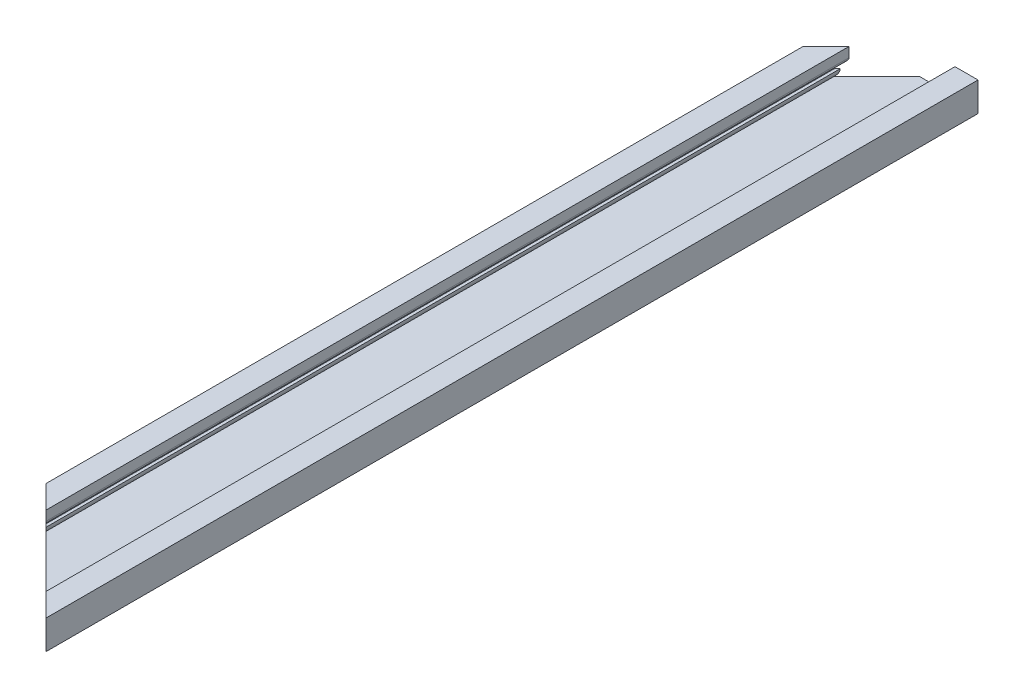
ISO-10303-21;
HEADER;
FILE_DESCRIPTION(('STEP AP214'),'2;1');
FILE_NAME('part.step','',(''),(''),'','','');
FILE_SCHEMA(('AUTOMOTIVE_DESIGN { 1 0 10303 214 1 1 1 1 }'));
ENDSEC;
DATA;
#1=APPLICATION_CONTEXT('core data for automotive mechanical design processes');
#2=APPLICATION_PROTOCOL_DEFINITION('international standard','automotive_design',2000,#1);
#3=PRODUCT_CONTEXT('',#1,'mechanical');
#4=PRODUCT('Part','Part','',(#3));
#5=PRODUCT_RELATED_PRODUCT_CATEGORY('part','',(#4));
#6=PRODUCT_DEFINITION_FORMATION('','',#4);
#7=PRODUCT_DEFINITION_CONTEXT('part definition',#1,'design');
#8=PRODUCT_DEFINITION('design','',#6,#7);
#9=PRODUCT_DEFINITION_SHAPE('','',#8);
#10=(LENGTH_UNIT() NAMED_UNIT(*) SI_UNIT(.MILLI.,.METRE.));
#11=(NAMED_UNIT(*) PLANE_ANGLE_UNIT() SI_UNIT($,.RADIAN.));
#12=(NAMED_UNIT(*) SI_UNIT($,.STERADIAN.) SOLID_ANGLE_UNIT());
#13=UNCERTAINTY_MEASURE_WITH_UNIT(LENGTH_MEASURE(1.E-05),#10,'distance_accuracy_value','');
#14=(GEOMETRIC_REPRESENTATION_CONTEXT(3) GLOBAL_UNCERTAINTY_ASSIGNED_CONTEXT((#13)) GLOBAL_UNIT_ASSIGNED_CONTEXT((#10,
#11,#12)) REPRESENTATION_CONTEXT('',''));
#15=CARTESIAN_POINT('',(0.,0.,0.));
#16=DIRECTION('',(0.,0.,1.));
#17=DIRECTION('',(1.,0.,0.));
#18=AXIS2_PLACEMENT_3D('',#15,#16,#17);
#19=CARTESIAN_POINT('',(-30.,7.5,510.));
#20=DIRECTION('',(0.,-1.,0.));
#21=DIRECTION('',(0.,0.,-1.));
#22=AXIS2_PLACEMENT_3D('',#19,#20,#21);
#23=PLANE('',#22);
#24=DIRECTION('',(0.707106781186546,0.,-0.707106781186549));
#25=VECTOR('',#24,1.);
#26=CARTESIAN_POINT('',(15.0000000000001,7.5,15.));
#27=LINE('',#26,#25);
#28=CARTESIAN_POINT('',(-30.,7.5,60.0000000000002));
#29=VERTEX_POINT('',#28);
#30=CARTESIAN_POINT('',(-18.1568883594902,7.5,48.1568883594904));
#31=VERTEX_POINT('',#30);
#32=EDGE_CURVE('E276',#29,#31,#27,.T.);
#33=ORIENTED_EDGE('',*,*,#32,.F.);
#34=DIRECTION('',(0.,0.,-1.));
#35=VECTOR('',#34,1.);
#36=CARTESIAN_POINT('',(-30.,7.5,510.));
#37=LINE('',#36,#35);
#38=CARTESIAN_POINT('',(-30.,7.5,450.));
#39=VERTEX_POINT('',#38);
#40=EDGE_CURVE('E201',#39,#29,#37,.T.);
#41=ORIENTED_EDGE('',*,*,#40,.F.);
#42=DIRECTION('',(0.707106781186546,0.,0.707106781186549));
#43=VECTOR('',#42,1.);
#44=CARTESIAN_POINT('',(-240.,7.5,239.999999999999));
#45=LINE('',#44,#43);
#46=CARTESIAN_POINT('',(-18.1568883594902,7.5,461.84311164051));
#47=VERTEX_POINT('',#46);
#48=EDGE_CURVE('E288',#39,#47,#45,.T.);
#49=ORIENTED_EDGE('',*,*,#48,.T.);
#50=DIRECTION('',(0.,0.,-1.));
#51=VECTOR('',#50,1.);
#52=CARTESIAN_POINT('',(-18.1568883594903,7.5,510.));
#53=LINE('',#52,#51);
#54=EDGE_CURVE('E358',#47,#31,#53,.T.);
#55=ORIENTED_EDGE('',*,*,#54,.T.);
#56=EDGE_LOOP('',(#33,#41,#49,#55));
#57=FACE_BOUND('',#56,.T.);
#58=ADVANCED_FACE('F43',(#57),#23,.F.);
#59=CARTESIAN_POINT('',(25.,0.5,510.));
#60=DIRECTION('',(0.,1.,0.));
#61=DIRECTION('',(-1.,0.,0.));
#62=AXIS2_PLACEMENT_3D('',#59,#60,#61);
#63=PLANE('',#62);
#64=DIRECTION('',(-0.707106781186546,0.,0.707106781186549));
#65=VECTOR('',#64,1.);
#66=CARTESIAN_POINT('',(-227.5,0.499999999999999,257.500000000001));
#67=LINE('',#66,#65);
#68=CARTESIAN_POINT('',(-20.1568883594903,0.5,50.1568883594905));
#69=VERTEX_POINT('',#68);
#70=CARTESIAN_POINT('',(-25.,0.5,55.0000000000003));
#71=VERTEX_POINT('',#70);
#72=EDGE_CURVE('E348',#69,#71,#67,.T.);
#73=ORIENTED_EDGE('',*,*,#72,.F.);
#74=DIRECTION('',(0.,0.,-1.));
#75=VECTOR('',#74,1.);
#76=CARTESIAN_POINT('',(-20.1568883594903,0.5,510.));
#77=LINE('',#76,#75);
#78=CARTESIAN_POINT('',(-20.1568883594903,0.5,459.84311164051));
#79=VERTEX_POINT('',#78);
#80=EDGE_CURVE('E219',#69,#79,#77,.F.);
#81=ORIENTED_EDGE('',*,*,#80,.T.);
#82=DIRECTION('',(-0.707106781186546,0.,-0.707106781186549));
#83=VECTOR('',#82,1.);
#84=CARTESIAN_POINT('',(27.5,0.5,507.5));
#85=LINE('',#84,#83);
#86=CARTESIAN_POINT('',(-25.,0.5,455.));
#87=VERTEX_POINT('',#86);
#88=EDGE_CURVE('E324',#79,#87,#85,.T.);
#89=ORIENTED_EDGE('',*,*,#88,.T.);
#90=DIRECTION('',(0.,0.,-1.));
#91=VECTOR('',#90,1.);
#92=CARTESIAN_POINT('',(-25.,0.5,510.));
#93=LINE('',#92,#91);
#94=EDGE_CURVE('E373',#87,#71,#93,.T.);
#95=ORIENTED_EDGE('',*,*,#94,.T.);
#96=EDGE_LOOP('',(#73,#81,#89,#95));
#97=FACE_BOUND('',#96,.T.);
#98=ADVANCED_FACE('F416',(#97),#63,.F.);
#99=DIRECTION('',(0.,0.,-1.));
#100=VECTOR('',#99,1.);
#101=CARTESIAN_POINT('',(30.,7.5,510.));
#102=LINE('',#101,#100);
#103=CARTESIAN_POINT('',(30.,7.5,510.));
#104=VERTEX_POINT('',#103);
#105=CARTESIAN_POINT('',(30.,7.5,30.0000000000001));
#106=VERTEX_POINT('',#105);
#107=EDGE_CURVE('E190',#104,#106,#102,.T.);
#108=ORIENTED_EDGE('',*,*,#107,.T.);
#109=DIRECTION('',(-1.,0.,0.));
#110=VECTOR('',#109,1.);
#111=CARTESIAN_POINT('',(30.,7.5,30.0000000000001));
#112=LINE('',#111,#110);
#113=CARTESIAN_POINT('',(18.1431116405097,7.5,30.0000000000001));
#114=VERTEX_POINT('',#113);
#115=EDGE_CURVE('E174',#106,#114,#112,.T.);
#116=ORIENTED_EDGE('',*,*,#115,.T.);
#117=DIRECTION('',(0.,0.,-1.));
#118=VECTOR('',#117,1.);
#119=CARTESIAN_POINT('',(18.1431116405097,7.5,510.));
#120=LINE('',#119,#118);
#121=CARTESIAN_POINT('',(18.1431116405098,7.5,498.14311164051));
#122=VERTEX_POINT('',#121);
#123=EDGE_CURVE('E359',#122,#114,#120,.T.);
#124=ORIENTED_EDGE('',*,*,#123,.F.);
#125=EDGE_CURVE('E198',#122,#104,#45,.T.);
#126=ORIENTED_EDGE('',*,*,#125,.T.);
#127=EDGE_LOOP('',(#108,#116,#124,#126));
#128=FACE_BOUND('',#127,.T.);
#129=ADVANCED_FACE('F197',(#128),#23,.F.);
#130=CARTESIAN_POINT('',(-30.,7.5,510.));
#131=DIRECTION('',(1.,0.,0.));
#132=DIRECTION('',(0.,1.,0.));
#133=AXIS2_PLACEMENT_3D('',#130,#131,#132);
#134=PLANE('',#133);
#135=DIRECTION('',(0.,-1.,0.));
#136=VECTOR('',#135,1.);
#137=CARTESIAN_POINT('',(-30.,7.5,60.0000000000002));
#138=LINE('',#137,#136);
#139=CARTESIAN_POINT('',(-30.,-7.5,60.0000000000002));
#140=VERTEX_POINT('',#139);
#141=EDGE_CURVE('E279',#29,#140,#138,.T.);
#142=ORIENTED_EDGE('',*,*,#141,.T.);
#143=DIRECTION('',(0.,0.,-1.));
#144=VECTOR('',#143,1.);
#145=CARTESIAN_POINT('',(-30.,-7.5,510.));
#146=LINE('',#145,#144);
#147=CARTESIAN_POINT('',(-30.,-7.5,450.));
#148=VERTEX_POINT('',#147);
#149=EDGE_CURVE('E208',#148,#140,#146,.T.);
#150=ORIENTED_EDGE('',*,*,#149,.F.);
#151=DIRECTION('',(0.,-1.,0.));
#152=VECTOR('',#151,1.);
#153=CARTESIAN_POINT('',(-30.,7.5,450.));
#154=LINE('',#153,#152);
#155=EDGE_CURVE('E284',#39,#148,#154,.T.);
#156=ORIENTED_EDGE('',*,*,#155,.F.);
#157=ORIENTED_EDGE('',*,*,#40,.T.);
#158=EDGE_LOOP('',(#142,#150,#156,#157));
#159=FACE_BOUND('',#158,.T.);
#160=ADVANCED_FACE('F399',(#159),#134,.F.);
#161=CARTESIAN_POINT('',(-30.,-7.5,510.));
#162=DIRECTION('',(0.,1.,0.));
#163=DIRECTION('',(0.,0.,1.));
#164=AXIS2_PLACEMENT_3D('',#161,#162,#163);
#165=PLANE('',#164);
#166=DIRECTION('',(0.707106781186546,0.,-0.707106781186549));
#167=VECTOR('',#166,1.);
#168=CARTESIAN_POINT('',(15.0000000000001,-7.5,15.));
#169=LINE('',#168,#167);
#170=CARTESIAN_POINT('',(0.,-7.5,30.0000000000001));
#171=VERTEX_POINT('',#170);
#172=EDGE_CURVE('E280',#140,#171,#169,.T.);
#173=ORIENTED_EDGE('',*,*,#172,.T.);
#174=DIRECTION('',(1.,0.,0.));
#175=VECTOR('',#174,1.);
#176=CARTESIAN_POINT('',(-29.9999999999999,-7.5,30.0000000000001));
#177=LINE('',#176,#175);
#178=CARTESIAN_POINT('',(30.,-7.5,30.0000000000001));
#179=VERTEX_POINT('',#178);
#180=EDGE_CURVE('E58',#171,#179,#177,.T.);
#181=ORIENTED_EDGE('',*,*,#180,.T.);
#182=DIRECTION('',(0.,0.,-1.));
#183=VECTOR('',#182,1.);
#184=CARTESIAN_POINT('',(30.,-7.5,510.));
#185=LINE('',#184,#183);
#186=CARTESIAN_POINT('',(30.,-7.5,510.));
#187=VERTEX_POINT('',#186);
#188=EDGE_CURVE('E192',#187,#179,#185,.T.);
#189=ORIENTED_EDGE('',*,*,#188,.F.);
#190=DIRECTION('',(0.707106781186546,0.,0.707106781186549));
#191=VECTOR('',#190,1.);
#192=CARTESIAN_POINT('',(-240.,-7.5,239.999999999999));
#193=LINE('',#192,#191);
#194=EDGE_CURVE('E275',#148,#187,#193,.T.);
#195=ORIENTED_EDGE('',*,*,#194,.F.);
#196=ORIENTED_EDGE('',*,*,#149,.T.);
#197=EDGE_LOOP('',(#173,#181,#189,#195,#196));
#198=FACE_BOUND('',#197,.T.);
#199=ADVANCED_FACE('F396',(#198),#165,.F.);
#200=CARTESIAN_POINT('',(-25.,-2.5,510.));
#201=DIRECTION('',(0.,0.,-1.));
#202=DIRECTION('',(-1.,0.,0.));
#203=AXIS2_PLACEMENT_3D('',#200,#201,#202);
#204=CYLINDRICAL_SURFACE('',#203,3.);
#205=CARTESIAN_POINT('',(-25.,-2.5,55.0000000000003));
#206=DIRECTION('',(-0.707106781186549,0.,-0.707106781186546));
#207=DIRECTION('',(0.707106781186546,0.,-0.707106781186549));
#208=AXIS2_PLACEMENT_3D('',#205,#206,#207);
#209=ELLIPSE('',#208,4.2426406871193,3.);
#210=CARTESIAN_POINT('',(-22.,-2.5,52.0000000000001));
#211=VERTEX_POINT('',#210);
#212=EDGE_CURVE('E345',#71,#211,#209,.F.);
#213=ORIENTED_EDGE('',*,*,#212,.F.);
#214=ORIENTED_EDGE('',*,*,#94,.F.);
#215=CARTESIAN_POINT('',(-25.,-2.5,455.));
#216=DIRECTION('',(0.707106781186549,0.,-0.707106781186546));
#217=DIRECTION('',(-0.707106781186546,0.,-0.707106781186549));
#218=AXIS2_PLACEMENT_3D('',#215,#216,#217);
#219=ELLIPSE('',#218,4.2426406871193,3.);
#220=CARTESIAN_POINT('',(-22.,-2.5,458.));
#221=VERTEX_POINT('',#220);
#222=EDGE_CURVE('E320',#87,#221,#219,.F.);
#223=ORIENTED_EDGE('',*,*,#222,.T.);
#224=DIRECTION('',(0.,0.,-1.));
#225=VECTOR('',#224,1.);
#226=CARTESIAN_POINT('',(-22.,-2.5,510.));
#227=LINE('',#226,#225);
#228=EDGE_CURVE('E205',#221,#211,#227,.T.);
#229=ORIENTED_EDGE('',*,*,#228,.T.);
#230=EDGE_LOOP('',(#213,#214,#223,#229));
#231=FACE_BOUND('',#230,.T.);
#232=ADVANCED_FACE('F421',(#231),#204,.F.);
#233=CARTESIAN_POINT('',(25.,-2.5,510.));
#234=DIRECTION('',(0.,0.,-1.));
#235=DIRECTION('',(-1.,0.,0.));
#236=AXIS2_PLACEMENT_3D('',#233,#234,#235);
#237=CYLINDRICAL_SURFACE('',#236,3.);
#238=DIRECTION('',(0.,0.,-1.));
#239=VECTOR('',#238,1.);
#240=CARTESIAN_POINT('',(25.,0.5,510.));
#241=LINE('',#240,#239);
#242=CARTESIAN_POINT('',(25.,0.5,505.));
#243=VERTEX_POINT('',#242);
#244=CARTESIAN_POINT('',(25.,0.5,30.0000000000001));
#245=VERTEX_POINT('',#244);
#246=EDGE_CURVE('E244',#243,#245,#241,.T.);
#247=ORIENTED_EDGE('',*,*,#246,.T.);
#248=CARTESIAN_POINT('',(25.,-2.5,30.0000000000001));
#249=DIRECTION('',(0.,0.,1.));
#250=DIRECTION('',(1.,0.,0.));
#251=AXIS2_PLACEMENT_3D('',#248,#249,#250);
#252=CIRCLE('',#251,3.);
#253=CARTESIAN_POINT('',(22.,-2.5,30.0000000000001));
#254=VERTEX_POINT('',#253);
#255=EDGE_CURVE('E257',#245,#254,#252,.F.);
#256=ORIENTED_EDGE('',*,*,#255,.T.);
#257=DIRECTION('',(0.,0.,-1.));
#258=VECTOR('',#257,1.);
#259=CARTESIAN_POINT('',(22.,-2.5,510.));
#260=LINE('',#259,#258);
#261=CARTESIAN_POINT('',(22.,-2.5,502.));
#262=VERTEX_POINT('',#261);
#263=EDGE_CURVE('E200',#254,#262,#260,.F.);
#264=ORIENTED_EDGE('',*,*,#263,.T.);
#265=CARTESIAN_POINT('',(25.,-2.5,505.));
#266=DIRECTION('',(0.707106781186549,0.,-0.707106781186546));
#267=DIRECTION('',(-0.707106781186546,0.,-0.707106781186549));
#268=AXIS2_PLACEMENT_3D('',#265,#266,#267);
#269=ELLIPSE('',#268,4.2426406871193,3.);
#270=EDGE_CURVE('E246',#262,#243,#269,.F.);
#271=ORIENTED_EDGE('',*,*,#270,.T.);
#272=EDGE_LOOP('',(#247,#256,#264,#271));
#273=FACE_BOUND('',#272,.T.);
#274=ADVANCED_FACE('F441',(#273),#237,.F.);
#275=DIRECTION('',(0.,0.,-1.));
#276=VECTOR('',#275,1.);
#277=CARTESIAN_POINT('',(20.1431116405097,0.5,510.));
#278=LINE('',#277,#276);
#279=CARTESIAN_POINT('',(20.1431116405097,0.5,500.14311164051));
#280=VERTEX_POINT('',#279);
#281=CARTESIAN_POINT('',(20.1431116405097,0.5,30.0000000000001));
#282=VERTEX_POINT('',#281);
#283=EDGE_CURVE('E223',#280,#282,#278,.T.);
#284=ORIENTED_EDGE('',*,*,#283,.T.);
#285=DIRECTION('',(1.,0.,0.));
#286=VECTOR('',#285,1.);
#287=CARTESIAN_POINT('',(25.0000000000001,0.5,30.0000000000001));
#288=LINE('',#287,#286);
#289=EDGE_CURVE('E252',#282,#245,#288,.T.);
#290=ORIENTED_EDGE('',*,*,#289,.T.);
#291=ORIENTED_EDGE('',*,*,#246,.F.);
#292=DIRECTION('',(-0.707106781186546,0.,-0.707106781186549));
#293=VECTOR('',#292,1.);
#294=CARTESIAN_POINT('',(27.5,0.5,507.5));
#295=LINE('',#294,#293);
#296=EDGE_CURVE('E234',#243,#280,#295,.T.);
#297=ORIENTED_EDGE('',*,*,#296,.T.);
#298=EDGE_LOOP('',(#284,#290,#291,#297));
#299=FACE_BOUND('',#298,.T.);
#300=ADVANCED_FACE('F241',(#299),#63,.F.);
#301=CARTESIAN_POINT('',(-25.,-2.5,510.));
#302=DIRECTION('',(0.,-1.,0.));
#303=DIRECTION('',(1.,0.,0.));
#304=AXIS2_PLACEMENT_3D('',#301,#302,#303);
#305=PLANE('',#304);
#306=DIRECTION('',(0.707106781186546,0.,-0.707106781186549));
#307=VECTOR('',#306,1.);
#308=CARTESIAN_POINT('',(-252.5,-2.49999999999993,282.500000000001));
#309=LINE('',#308,#307);
#310=CARTESIAN_POINT('',(-20.5,-2.5,50.5000000000003));
#311=VERTEX_POINT('',#310);
#312=EDGE_CURVE('E342',#211,#311,#309,.T.);
#313=ORIENTED_EDGE('',*,*,#312,.F.);
#314=ORIENTED_EDGE('',*,*,#228,.F.);
#315=DIRECTION('',(0.707106781186546,0.,0.707106781186549));
#316=VECTOR('',#315,1.);
#317=CARTESIAN_POINT('',(2.50000000000011,-2.50000000000001,482.5));
#318=LINE('',#317,#316);
#319=CARTESIAN_POINT('',(-20.5,-2.5,459.5));
#320=VERTEX_POINT('',#319);
#321=EDGE_CURVE('E316',#221,#320,#318,.T.);
#322=ORIENTED_EDGE('',*,*,#321,.T.);
#323=DIRECTION('',(0.,0.,-1.));
#324=VECTOR('',#323,1.);
#325=CARTESIAN_POINT('',(-20.5,-2.5,510.));
#326=LINE('',#325,#324);
#327=EDGE_CURVE('E377',#320,#311,#326,.T.);
#328=ORIENTED_EDGE('',*,*,#327,.T.);
#329=EDGE_LOOP('',(#313,#314,#322,#328));
#330=FACE_BOUND('',#329,.T.);
#331=ADVANCED_FACE('F424',(#330),#305,.F.);
#332=CARTESIAN_POINT('',(20.5,-2.5,510.));
#333=DIRECTION('',(0.,-1.,0.));
#334=DIRECTION('',(1.,0.,0.));
#335=AXIS2_PLACEMENT_3D('',#332,#333,#334);
#336=PLANE('',#335);
#337=ORIENTED_EDGE('',*,*,#263,.F.);
#338=DIRECTION('',(-1.,0.,0.));
#339=VECTOR('',#338,1.);
#340=CARTESIAN_POINT('',(20.5000000000001,-2.5,30.0000000000001));
#341=LINE('',#340,#339);
#342=CARTESIAN_POINT('',(20.5,-2.5,30.0000000000001));
#343=VERTEX_POINT('',#342);
#344=EDGE_CURVE('E261',#254,#343,#341,.T.);
#345=ORIENTED_EDGE('',*,*,#344,.T.);
#346=DIRECTION('',(0.,0.,-1.));
#347=VECTOR('',#346,1.);
#348=CARTESIAN_POINT('',(20.5,-2.5,510.));
#349=LINE('',#348,#347);
#350=CARTESIAN_POINT('',(20.5,-2.5,500.5));
#351=VERTEX_POINT('',#350);
#352=EDGE_CURVE('E366',#351,#343,#349,.T.);
#353=ORIENTED_EDGE('',*,*,#352,.F.);
#354=DIRECTION('',(0.707106781186546,0.,0.707106781186549));
#355=VECTOR('',#354,1.);
#356=CARTESIAN_POINT('',(25.25,-2.5,505.25));
#357=LINE('',#356,#355);
#358=EDGE_CURVE('E300',#351,#262,#357,.T.);
#359=ORIENTED_EDGE('',*,*,#358,.T.);
#360=EDGE_LOOP('',(#337,#345,#353,#359));
#361=FACE_BOUND('',#360,.T.);
#362=ADVANCED_FACE('F439',(#361),#336,.F.);
#363=CARTESIAN_POINT('',(25.,-2.5,510.));
#364=DIRECTION('',(0.,0.,-1.));
#365=DIRECTION('',(-1.,0.,0.));
#366=AXIS2_PLACEMENT_3D('',#363,#364,#365);
#367=CYLINDRICAL_SURFACE('',#366,4.5);
#368=ORIENTED_EDGE('',*,*,#352,.T.);
#369=CARTESIAN_POINT('',(25.,-2.5,30.0000000000001));
#370=DIRECTION('',(0.,0.,1.));
#371=DIRECTION('',(1.,0.,0.));
#372=AXIS2_PLACEMENT_3D('',#369,#370,#371);
#373=CIRCLE('',#372,4.5);
#374=CARTESIAN_POINT('',(22.1715728752538,-6.,30.0000000000001));
#375=VERTEX_POINT('',#374);
#376=EDGE_CURVE('E265',#343,#375,#373,.T.);
#377=ORIENTED_EDGE('',*,*,#376,.T.);
#378=DIRECTION('',(0.,0.,-1.));
#379=VECTOR('',#378,1.);
#380=CARTESIAN_POINT('',(22.1715728752538,-6.,510.));
#381=LINE('',#380,#379);
#382=CARTESIAN_POINT('',(22.1715728752538,-6.,502.171572875254));
#383=VERTEX_POINT('',#382);
#384=EDGE_CURVE('E362',#383,#375,#381,.T.);
#385=ORIENTED_EDGE('',*,*,#384,.F.);
#386=CARTESIAN_POINT('',(25.,-2.5,505.));
#387=DIRECTION('',(0.707106781186549,0.,-0.707106781186546));
#388=DIRECTION('',(-0.707106781186546,0.,-0.707106781186549));
#389=AXIS2_PLACEMENT_3D('',#386,#387,#388);
#390=ELLIPSE('',#389,6.36396103067894,4.5);
#391=EDGE_CURVE('E304',#383,#351,#390,.T.);
#392=ORIENTED_EDGE('',*,*,#391,.T.);
#393=EDGE_LOOP('',(#368,#377,#385,#392));
#394=FACE_BOUND('',#393,.T.);
#395=ADVANCED_FACE('F435',(#394),#367,.T.);
#396=CARTESIAN_POINT('',(-25.,-2.5,510.));
#397=DIRECTION('',(0.,0.,-1.));
#398=DIRECTION('',(-1.,0.,0.));
#399=AXIS2_PLACEMENT_3D('',#396,#397,#398);
#400=CYLINDRICAL_SURFACE('',#399,4.5);
#401=CARTESIAN_POINT('',(-25.,-2.5,55.0000000000003));
#402=DIRECTION('',(-0.707106781186549,0.,-0.707106781186546));
#403=DIRECTION('',(0.707106781186546,0.,-0.707106781186549));
#404=AXIS2_PLACEMENT_3D('',#401,#402,#403);
#405=ELLIPSE('',#404,6.36396103067895,4.5);
#406=CARTESIAN_POINT('',(-22.1715728752538,-6.,52.171572875254));
#407=VERTEX_POINT('',#406);
#408=EDGE_CURVE('E339',#311,#407,#405,.T.);
#409=ORIENTED_EDGE('',*,*,#408,.F.);
#410=ORIENTED_EDGE('',*,*,#327,.F.);
#411=CARTESIAN_POINT('',(-25.,-2.5,455.));
#412=DIRECTION('',(0.707106781186549,0.,-0.707106781186546));
#413=DIRECTION('',(-0.707106781186546,0.,-0.707106781186549));
#414=AXIS2_PLACEMENT_3D('',#411,#412,#413);
#415=ELLIPSE('',#414,6.36396103067895,4.5);
#416=CARTESIAN_POINT('',(-22.1715728752538,-6.,457.828427124746));
#417=VERTEX_POINT('',#416);
#418=EDGE_CURVE('E312',#320,#417,#415,.T.);
#419=ORIENTED_EDGE('',*,*,#418,.T.);
#420=DIRECTION('',(0.,0.,-1.));
#421=VECTOR('',#420,1.);
#422=CARTESIAN_POINT('',(-22.1715728752538,-6.,510.));
#423=LINE('',#422,#421);
#424=EDGE_CURVE('E381',#417,#407,#423,.T.);
#425=ORIENTED_EDGE('',*,*,#424,.T.);
#426=EDGE_LOOP('',(#409,#410,#419,#425));
#427=FACE_BOUND('',#426,.T.);
#428=ADVANCED_FACE('F429',(#427),#400,.T.);
#429=CARTESIAN_POINT('',(22.1715728752538,-6.,510.));
#430=DIRECTION('',(0.,-1.,0.));
#431=DIRECTION('',(0.,0.,-1.));
#432=AXIS2_PLACEMENT_3D('',#429,#430,#431);
#433=PLANE('',#432);
#434=ORIENTED_EDGE('',*,*,#384,.T.);
#435=DIRECTION('',(-1.,0.,0.));
#436=VECTOR('',#435,1.);
#437=CARTESIAN_POINT('',(22.1715728752539,-6.,30.0000000000001));
#438=LINE('',#437,#436);
#439=CARTESIAN_POINT('',(0.,-6.,30.0000000000001));
#440=VERTEX_POINT('',#439);
#441=EDGE_CURVE('E269',#375,#440,#438,.T.);
#442=ORIENTED_EDGE('',*,*,#441,.T.);
#443=DIRECTION('',(0.707106781186546,0.,-0.707106781186549));
#444=VECTOR('',#443,1.);
#445=CARTESIAN_POINT('',(-228.914213562373,-6.,258.914213562374));
#446=LINE('',#445,#444);
#447=EDGE_CURVE('E335',#407,#440,#446,.T.);
#448=ORIENTED_EDGE('',*,*,#447,.F.);
#449=ORIENTED_EDGE('',*,*,#424,.F.);
#450=DIRECTION('',(0.707106781186546,0.,0.707106781186549));
#451=VECTOR('',#450,1.);
#452=CARTESIAN_POINT('',(26.0857864376269,-6.,506.085786437627));
#453=LINE('',#452,#451);
#454=EDGE_CURVE('E308',#417,#383,#453,.T.);
#455=ORIENTED_EDGE('',*,*,#454,.T.);
#456=EDGE_LOOP('',(#434,#442,#448,#449,#455));
#457=FACE_BOUND('',#456,.T.);
#458=ADVANCED_FACE('F432',(#457),#433,.F.);
#459=CARTESIAN_POINT('',(18.1431116405097,0.5,510.));
#460=DIRECTION('',(1.,0.,0.));
#461=DIRECTION('',(0.,0.,-1.));
#462=AXIS2_PLACEMENT_3D('',#459,#460,#461);
#463=PLANE('',#462);
#464=ORIENTED_EDGE('',*,*,#123,.T.);
#465=DIRECTION('',(0.,-1.,0.));
#466=VECTOR('',#465,1.);
#467=CARTESIAN_POINT('',(18.1431116405097,0.5,30.0000000000001));
#468=LINE('',#467,#466);
#469=CARTESIAN_POINT('',(18.1431116405097,2.5,30.0000000000001));
#470=VERTEX_POINT('',#469);
#471=EDGE_CURVE('E178',#114,#470,#468,.T.);
#472=ORIENTED_EDGE('',*,*,#471,.T.);
#473=DIRECTION('',(0.,0.,-1.));
#474=VECTOR('',#473,1.);
#475=CARTESIAN_POINT('',(18.1431116405097,2.5,510.));
#476=LINE('',#475,#474);
#477=CARTESIAN_POINT('',(18.1431116405097,2.5,498.14311164051));
#478=VERTEX_POINT('',#477);
#479=EDGE_CURVE('E66',#470,#478,#476,.F.);
#480=ORIENTED_EDGE('',*,*,#479,.T.);
#481=DIRECTION('',(0.,1.,0.));
#482=VECTOR('',#481,1.);
#483=CARTESIAN_POINT('',(18.1431116405097,0.5,498.14311164051));
#484=LINE('',#483,#482);
#485=EDGE_CURVE('E236',#478,#122,#484,.T.);
#486=ORIENTED_EDGE('',*,*,#485,.T.);
#487=EDGE_LOOP('',(#464,#472,#480,#486));
#488=FACE_BOUND('',#487,.T.);
#489=ADVANCED_FACE('F443',(#488),#463,.F.);
#490=CARTESIAN_POINT('',(-18.1568883594903,7.5,510.));
#491=DIRECTION('',(-1.,0.,0.));
#492=DIRECTION('',(0.,0.,1.));
#493=AXIS2_PLACEMENT_3D('',#490,#491,#492);
#494=PLANE('',#493);
#495=DIRECTION('',(0.,-1.,0.));
#496=VECTOR('',#495,1.);
#497=CARTESIAN_POINT('',(-18.1568883594903,7.5,48.1568883594905));
#498=LINE('',#497,#496);
#499=CARTESIAN_POINT('',(-18.1568883594903,2.5,48.1568883594906));
#500=VERTEX_POINT('',#499);
#501=EDGE_CURVE('E355',#31,#500,#498,.T.);
#502=ORIENTED_EDGE('',*,*,#501,.F.);
#503=ORIENTED_EDGE('',*,*,#54,.F.);
#504=DIRECTION('',(0.,-1.,0.));
#505=VECTOR('',#504,1.);
#506=CARTESIAN_POINT('',(-18.1568883594903,7.5,461.84311164051));
#507=LINE('',#506,#505);
#508=CARTESIAN_POINT('',(-18.1568883594903,2.5,461.84311164051));
#509=VERTEX_POINT('',#508);
#510=EDGE_CURVE('E331',#47,#509,#507,.T.);
#511=ORIENTED_EDGE('',*,*,#510,.T.);
#512=DIRECTION('',(0.,0.,-1.));
#513=VECTOR('',#512,1.);
#514=CARTESIAN_POINT('',(-18.1568883594903,2.5,510.));
#515=LINE('',#514,#513);
#516=EDGE_CURVE('E215',#509,#500,#515,.T.);
#517=ORIENTED_EDGE('',*,*,#516,.T.);
#518=EDGE_LOOP('',(#502,#503,#511,#517));
#519=FACE_BOUND('',#518,.T.);
#520=ADVANCED_FACE('F408',(#519),#494,.F.);
#521=CARTESIAN_POINT('',(-20.1568883594903,2.5,510.));
#522=DIRECTION('',(0.,0.,-1.));
#523=DIRECTION('',(-1.,0.,0.));
#524=AXIS2_PLACEMENT_3D('',#521,#522,#523);
#525=CYLINDRICAL_SURFACE('',#524,2.);
#526=ORIENTED_EDGE('',*,*,#80,.F.);
#527=CARTESIAN_POINT('',(-20.1568883594903,2.5,50.1568883594906));
#528=DIRECTION('',(-0.707106781186549,0.,-0.707106781186546));
#529=DIRECTION('',(0.707106781186546,0.,-0.707106781186549));
#530=AXIS2_PLACEMENT_3D('',#527,#528,#529);
#531=ELLIPSE('',#530,2.8284271247462,2.);
#532=EDGE_CURVE('E351',#69,#500,#531,.F.);
#533=ORIENTED_EDGE('',*,*,#532,.T.);
#534=ORIENTED_EDGE('',*,*,#516,.F.);
#535=CARTESIAN_POINT('',(-20.1568883594903,2.5,459.84311164051));
#536=DIRECTION('',(0.707106781186549,0.,-0.707106781186546));
#537=DIRECTION('',(-0.707106781186546,0.,-0.707106781186549));
#538=AXIS2_PLACEMENT_3D('',#535,#536,#537);
#539=ELLIPSE('',#538,2.8284271247462,2.);
#540=EDGE_CURVE('E328',#79,#509,#539,.F.);
#541=ORIENTED_EDGE('',*,*,#540,.F.);
#542=EDGE_LOOP('',(#526,#533,#534,#541));
#543=FACE_BOUND('',#542,.T.);
#544=ADVANCED_FACE('F413',(#543),#525,.T.);
#545=CARTESIAN_POINT('',(20.1431116405097,2.5,510.));
#546=DIRECTION('',(0.,0.,-1.));
#547=DIRECTION('',(-1.,0.,0.));
#548=AXIS2_PLACEMENT_3D('',#545,#546,#547);
#549=CYLINDRICAL_SURFACE('',#548,2.);
#550=CARTESIAN_POINT('',(20.1431116405097,2.5,30.0000000000001));
#551=DIRECTION('',(0.,0.,1.));
#552=DIRECTION('',(1.,0.,0.));
#553=AXIS2_PLACEMENT_3D('',#550,#551,#552);
#554=CIRCLE('',#553,2.);
#555=EDGE_CURVE('E194',#282,#470,#554,.F.);
#556=ORIENTED_EDGE('',*,*,#555,.F.);
#557=ORIENTED_EDGE('',*,*,#283,.F.);
#558=CARTESIAN_POINT('',(20.1431116405097,2.5,500.14311164051));
#559=DIRECTION('',(0.707106781186549,0.,-0.707106781186546));
#560=DIRECTION('',(-0.707106781186546,0.,-0.707106781186549));
#561=AXIS2_PLACEMENT_3D('',#558,#559,#560);
#562=ELLIPSE('',#561,2.8284271247462,2.);
#563=EDGE_CURVE('E52',#478,#280,#562,.F.);
#564=ORIENTED_EDGE('',*,*,#563,.F.);
#565=ORIENTED_EDGE('',*,*,#479,.F.);
#566=EDGE_LOOP('',(#556,#557,#564,#565));
#567=FACE_BOUND('',#566,.T.);
#568=ADVANCED_FACE('F45',(#567),#549,.T.);
#569=CARTESIAN_POINT('',(30.,7.5,510.));
#570=DIRECTION('',(-1.,0.,0.));
#571=DIRECTION('',(0.,-1.,0.));
#572=AXIS2_PLACEMENT_3D('',#569,#570,#571);
#573=PLANE('',#572);
#574=ORIENTED_EDGE('',*,*,#188,.T.);
#575=DIRECTION('',(0.,-1.,0.));
#576=VECTOR('',#575,1.);
#577=CARTESIAN_POINT('',(30.,7.5,30.0000000000001));
#578=LINE('',#577,#576);
#579=EDGE_CURVE('E177',#106,#179,#578,.T.);
#580=ORIENTED_EDGE('',*,*,#579,.F.);
#581=ORIENTED_EDGE('',*,*,#107,.F.);
#582=DIRECTION('',(0.,1.,0.));
#583=VECTOR('',#582,1.);
#584=CARTESIAN_POINT('',(30.,7.5,510.));
#585=LINE('',#584,#583);
#586=EDGE_CURVE('E370',#187,#104,#585,.T.);
#587=ORIENTED_EDGE('',*,*,#586,.F.);
#588=EDGE_LOOP('',(#574,#580,#581,#587));
#589=FACE_BOUND('',#588,.T.);
#590=ADVANCED_FACE('F188',(#589),#573,.F.);
#591=CARTESIAN_POINT('',(-240.,7.5,239.999999999999));
#592=DIRECTION('',(0.707106781186549,0.,-0.707106781186546));
#593=DIRECTION('',(-0.707106781186546,0.,-0.707106781186549));
#594=AXIS2_PLACEMENT_3D('',#591,#592,#593);
#595=PLANE('',#594);
#596=ORIENTED_EDGE('',*,*,#48,.F.);
#597=ORIENTED_EDGE('',*,*,#155,.T.);
#598=ORIENTED_EDGE('',*,*,#194,.T.);
#599=ORIENTED_EDGE('',*,*,#586,.T.);
#600=ORIENTED_EDGE('',*,*,#125,.F.);
#601=ORIENTED_EDGE('',*,*,#485,.F.);
#602=ORIENTED_EDGE('',*,*,#563,.T.);
#603=ORIENTED_EDGE('',*,*,#296,.F.);
#604=ORIENTED_EDGE('',*,*,#270,.F.);
#605=ORIENTED_EDGE('',*,*,#358,.F.);
#606=ORIENTED_EDGE('',*,*,#391,.F.);
#607=ORIENTED_EDGE('',*,*,#454,.F.);
#608=ORIENTED_EDGE('',*,*,#418,.F.);
#609=ORIENTED_EDGE('',*,*,#321,.F.);
#610=ORIENTED_EDGE('',*,*,#222,.F.);
#611=ORIENTED_EDGE('',*,*,#88,.F.);
#612=ORIENTED_EDGE('',*,*,#540,.T.);
#613=ORIENTED_EDGE('',*,*,#510,.F.);
#614=EDGE_LOOP('',(#596,#597,#598,#599,#600,#601,#602,#603,#604,#605,#606,#607,#608,#609,#610,
#611,#612,#613));
#615=FACE_BOUND('',#614,.T.);
#616=ADVANCED_FACE('F232',(#615),#595,.F.);
#617=CARTESIAN_POINT('',(15.0000000000001,7.5,15.));
#618=DIRECTION('',(-0.707106781186549,0.,-0.707106781186546));
#619=DIRECTION('',(-0.707106781186546,0.,0.707106781186549));
#620=AXIS2_PLACEMENT_3D('',#617,#618,#619);
#621=PLANE('',#620);
#622=DIRECTION('',(0.,1.,0.));
#623=VECTOR('',#622,1.);
#624=CARTESIAN_POINT('',(0.,7.5,30.0000000000001));
#625=LINE('',#624,#623);
#626=EDGE_CURVE('E11',#171,#440,#625,.T.);
#627=ORIENTED_EDGE('',*,*,#626,.F.);
#628=ORIENTED_EDGE('',*,*,#172,.F.);
#629=ORIENTED_EDGE('',*,*,#141,.F.);
#630=ORIENTED_EDGE('',*,*,#32,.T.);
#631=ORIENTED_EDGE('',*,*,#501,.T.);
#632=ORIENTED_EDGE('',*,*,#532,.F.);
#633=ORIENTED_EDGE('',*,*,#72,.T.);
#634=ORIENTED_EDGE('',*,*,#212,.T.);
#635=ORIENTED_EDGE('',*,*,#312,.T.);
#636=ORIENTED_EDGE('',*,*,#408,.T.);
#637=ORIENTED_EDGE('',*,*,#447,.T.);
#638=EDGE_LOOP('',(#627,#628,#629,#630,#631,#632,#633,#634,#635,#636,#637));
#639=FACE_BOUND('',#638,.T.);
#640=ADVANCED_FACE('F403',(#639),#621,.T.);
#641=CARTESIAN_POINT('',(30.,7.5,30.0000000000001));
#642=DIRECTION('',(0.,0.,1.));
#643=DIRECTION('',(1.,0.,0.));
#644=AXIS2_PLACEMENT_3D('',#641,#642,#643);
#645=PLANE('',#644);
#646=ORIENTED_EDGE('',*,*,#626,.T.);
#647=ORIENTED_EDGE('',*,*,#441,.F.);
#648=ORIENTED_EDGE('',*,*,#376,.F.);
#649=ORIENTED_EDGE('',*,*,#344,.F.);
#650=ORIENTED_EDGE('',*,*,#255,.F.);
#651=ORIENTED_EDGE('',*,*,#289,.F.);
#652=ORIENTED_EDGE('',*,*,#555,.T.);
#653=ORIENTED_EDGE('',*,*,#471,.F.);
#654=ORIENTED_EDGE('',*,*,#115,.F.);
#655=ORIENTED_EDGE('',*,*,#579,.T.);
#656=ORIENTED_EDGE('',*,*,#180,.F.);
#657=EDGE_LOOP('',(#646,#647,#648,#649,#650,#651,#652,#653,#654,#655,#656));
#658=FACE_BOUND('',#657,.T.);
#659=ADVANCED_FACE('F176',(#658),#645,.F.);
#660=CLOSED_SHELL('',(#58,#98,#129,#160,#199,#232,#274,#300,#331,#362,#395,#428,#458,#489,#520,
#544,#568,#590,#616,#640,#659));
#661=MANIFOLD_SOLID_BREP('B2',#660);
#662=ADVANCED_BREP_SHAPE_REPRESENTATION('',(#18,#661),#14);
#663=SHAPE_DEFINITION_REPRESENTATION(#9,#662);
ENDSEC;
END-ISO-10303-21;
